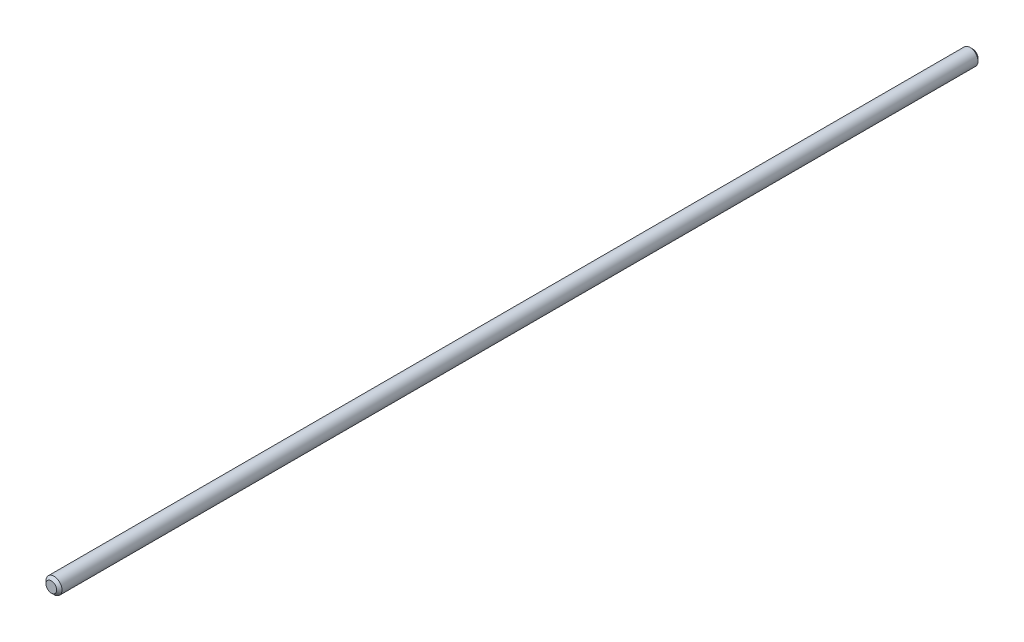
ISO-10303-21;
HEADER;
FILE_DESCRIPTION(('STEP AP214'),'2;1');
FILE_NAME('part.step','',(''),(''),'','','');
FILE_SCHEMA(('AUTOMOTIVE_DESIGN { 1 0 10303 214 1 1 1 1 }'));
ENDSEC;
DATA;
#1=APPLICATION_CONTEXT('core data for automotive mechanical design processes');
#2=APPLICATION_PROTOCOL_DEFINITION('international standard','automotive_design',2000,#1);
#3=PRODUCT_CONTEXT('',#1,'mechanical');
#4=PRODUCT('Part','Part','',(#3));
#5=PRODUCT_RELATED_PRODUCT_CATEGORY('part','',(#4));
#6=PRODUCT_DEFINITION_FORMATION('','',#4);
#7=PRODUCT_DEFINITION_CONTEXT('part definition',#1,'design');
#8=PRODUCT_DEFINITION('design','',#6,#7);
#9=PRODUCT_DEFINITION_SHAPE('','',#8);
#10=(LENGTH_UNIT() NAMED_UNIT(*) SI_UNIT(.MILLI.,.METRE.));
#11=(NAMED_UNIT(*) PLANE_ANGLE_UNIT() SI_UNIT($,.RADIAN.));
#12=(NAMED_UNIT(*) SI_UNIT($,.STERADIAN.) SOLID_ANGLE_UNIT());
#13=UNCERTAINTY_MEASURE_WITH_UNIT(LENGTH_MEASURE(1.E-05),#10,'distance_accuracy_value','');
#14=(GEOMETRIC_REPRESENTATION_CONTEXT(3) GLOBAL_UNCERTAINTY_ASSIGNED_CONTEXT((#13)) GLOBAL_UNIT_ASSIGNED_CONTEXT((#10,
#11,#12)) REPRESENTATION_CONTEXT('',''));
#15=CARTESIAN_POINT('',(0.,0.,0.));
#16=DIRECTION('',(0.,0.,1.));
#17=DIRECTION('',(1.,0.,0.));
#18=AXIS2_PLACEMENT_3D('',#15,#16,#17);
#19=CARTESIAN_POINT('',(0.,0.,172.8));
#20=DIRECTION('',(0.,0.,-1.));
#21=DIRECTION('',(-1.,0.,0.));
#22=AXIS2_PLACEMENT_3D('',#19,#20,#21);
#23=CYLINDRICAL_SURFACE('',#22,1.5);
#24=CARTESIAN_POINT('',(0.,0.,172.3));
#25=DIRECTION('',(0.,0.,1.));
#26=DIRECTION('',(1.,0.,0.));
#27=AXIS2_PLACEMENT_3D('',#24,#25,#26);
#28=CIRCLE('',#27,1.5);
#29=CARTESIAN_POINT('',(-1.5,0.,172.3));
#30=VERTEX_POINT('',#29);
#31=EDGE_CURVE('E44',#30,#30,#28,.F.);
#32=CARTESIAN_POINT('',(0.,0.,0.500000000000139));
#33=DIRECTION('',(0.,0.,1.));
#34=DIRECTION('',(1.,0.,0.));
#35=AXIS2_PLACEMENT_3D('',#32,#33,#34);
#36=CIRCLE('',#35,1.5);
#37=CARTESIAN_POINT('',(-1.5,0.,0.500000000000139));
#38=VERTEX_POINT('',#37);
#39=EDGE_CURVE('E48',#38,#38,#36,.T.);
#40=CARTESIAN_POINT('',(-1.5,0.,172.3));
#41=CARTESIAN_POINT('',(-1.5,0.,170.510416666667));
#42=CARTESIAN_POINT('',(-1.5,0.,168.720833333333));
#43=CARTESIAN_POINT('',(-1.5,0.,165.141666666667));
#44=CARTESIAN_POINT('',(-1.5,0.,163.352083333333));
#45=CARTESIAN_POINT('',(-1.5,0.,159.772916666667));
#46=CARTESIAN_POINT('',(-1.5,0.,157.983333333333));
#47=CARTESIAN_POINT('',(-1.5,0.,154.404166666667));
#48=CARTESIAN_POINT('',(-1.5,0.,152.614583333333));
#49=CARTESIAN_POINT('',(-1.5,0.,149.035416666667));
#50=CARTESIAN_POINT('',(-1.5,0.,147.245833333333));
#51=CARTESIAN_POINT('',(-1.5,0.,143.666666666667));
#52=CARTESIAN_POINT('',(-1.5,0.,141.877083333333));
#53=CARTESIAN_POINT('',(-1.5,0.,138.297916666667));
#54=CARTESIAN_POINT('',(-1.5,0.,136.508333333333));
#55=CARTESIAN_POINT('',(-1.5,0.,132.929166666667));
#56=CARTESIAN_POINT('',(-1.5,0.,131.139583333333));
#57=CARTESIAN_POINT('',(-1.5,0.,127.560416666667));
#58=CARTESIAN_POINT('',(-1.5,0.,125.770833333333));
#59=CARTESIAN_POINT('',(-1.5,0.,122.191666666667));
#60=CARTESIAN_POINT('',(-1.5,0.,120.402083333333));
#61=CARTESIAN_POINT('',(-1.5,0.,116.822916666667));
#62=CARTESIAN_POINT('',(-1.5,0.,115.033333333333));
#63=CARTESIAN_POINT('',(-1.5,0.,111.454166666667));
#64=CARTESIAN_POINT('',(-1.5,0.,109.664583333333));
#65=CARTESIAN_POINT('',(-1.5,0.,106.085416666667));
#66=CARTESIAN_POINT('',(-1.5,0.,104.295833333333));
#67=CARTESIAN_POINT('',(-1.5,0.,100.716666666667));
#68=CARTESIAN_POINT('',(-1.5,0.,98.9270833333334));
#69=CARTESIAN_POINT('',(-1.5,0.,95.3479166666668));
#70=CARTESIAN_POINT('',(-1.5,0.,93.5583333333334));
#71=CARTESIAN_POINT('',(-1.5,0.,89.9791666666668));
#72=CARTESIAN_POINT('',(-1.5,0.,88.1895833333334));
#73=CARTESIAN_POINT('',(-1.5,0.,84.6104166666668));
#74=CARTESIAN_POINT('',(-1.5,0.,82.8208333333334));
#75=CARTESIAN_POINT('',(-1.5,0.,79.2416666666668));
#76=CARTESIAN_POINT('',(-1.5,0.,77.4520833333334));
#77=CARTESIAN_POINT('',(-1.5,0.,73.8729166666668));
#78=CARTESIAN_POINT('',(-1.5,0.,72.0833333333334));
#79=CARTESIAN_POINT('',(-1.5,0.,68.5041666666668));
#80=CARTESIAN_POINT('',(-1.5,0.,66.7145833333334));
#81=CARTESIAN_POINT('',(-1.5,0.,63.1354166666668));
#82=CARTESIAN_POINT('',(-1.5,0.,61.3458333333334));
#83=CARTESIAN_POINT('',(-1.5,0.,57.7666666666668));
#84=CARTESIAN_POINT('',(-1.5,0.,55.9770833333334));
#85=CARTESIAN_POINT('',(-1.5,0.,52.3979166666668));
#86=CARTESIAN_POINT('',(-1.5,0.,50.6083333333334));
#87=CARTESIAN_POINT('',(-1.5,0.,47.0291666666668));
#88=CARTESIAN_POINT('',(-1.5,0.,45.2395833333335));
#89=CARTESIAN_POINT('',(-1.5,0.,41.6604166666668));
#90=CARTESIAN_POINT('',(-1.5,0.,39.8708333333335));
#91=CARTESIAN_POINT('',(-1.5,0.,36.2916666666668));
#92=CARTESIAN_POINT('',(-1.5,0.,34.5020833333335));
#93=CARTESIAN_POINT('',(-1.5,0.,30.9229166666668));
#94=CARTESIAN_POINT('',(-1.5,0.,29.1333333333335));
#95=CARTESIAN_POINT('',(-1.5,0.,25.5541666666668));
#96=CARTESIAN_POINT('',(-1.5,0.,23.7645833333335));
#97=CARTESIAN_POINT('',(-1.5,0.,20.1854166666668));
#98=CARTESIAN_POINT('',(-1.5,0.,18.3958333333335));
#99=CARTESIAN_POINT('',(-1.5,0.,14.8166666666668));
#100=CARTESIAN_POINT('',(-1.5,0.,13.0270833333335));
#101=CARTESIAN_POINT('',(-1.5,0.,9.4479166666668));
#102=CARTESIAN_POINT('',(-1.5,0.,7.65833333333347));
#103=CARTESIAN_POINT('',(-1.5,0.,4.07916666666681));
#104=CARTESIAN_POINT('',(-1.5,0.,2.28958333333347));
#105=CARTESIAN_POINT('',(-1.5,0.,0.500000000000139));
#106=B_SPLINE_CURVE_WITH_KNOTS('',3,(#40,#41,#42,#43,#44,#45,#46,#47,#48,#49,#50,#51,#52,#53,
#54,#55,#56,#57,#58,#59,#60,#61,#62,#63,#64,#65,#66,#67,#68,#69,#70,#71,#72,#73,#74,#75,#76,#77,
#78,#79,#80,#81,#82,#83,#84,#85,#86,#87,#88,#89,#90,#91,#92,#93,#94,#95,#96,#97,#98,#99,#100,
#101,#102,#103,#104,#105),.UNSPECIFIED.,.F.,.F.,(4,2,2,2,2,2,2,2,2,2,2,2,2,2,2,2,2,2,2,2,2,2,2,
2,2,2,2,2,2,2,2,2,4),(0.,5.36874999999998,10.7375,16.10625,21.475,26.84375,32.2124999999999,
37.58125,42.95,48.31875,53.6875,59.0562499999999,64.4249999999999,69.7937499999999,
75.1624999999999,80.5312499999999,85.8999999999999,91.2687499999999,96.6374999999999,102.00625,
107.375,112.74375,118.1125,123.48125,128.85,134.21875,139.5875,144.95625,150.325,155.69375,
161.0625,166.43125,171.8),.UNSPECIFIED.);
#107=EDGE_CURVE('BSEAM36',#30,#38,#106,.T.);
#108=ORIENTED_EDGE('',*,*,#31,.T.);
#109=ORIENTED_EDGE('',*,*,#39,.T.);
#110=ORIENTED_EDGE('',*,*,#107,.T.);
#111=ORIENTED_EDGE('',*,*,#107,.F.);
#112=EDGE_LOOP('',(#108,#110,#109,#111));
#113=FACE_BOUND('',#112,.T.);
#114=ADVANCED_FACE('F36',(#113),#23,.T.);
#115=CARTESIAN_POINT('',(0.,0.,172.8));
#116=DIRECTION('',(0.,0.,1.));
#117=DIRECTION('',(1.,0.,0.));
#118=AXIS2_PLACEMENT_3D('',#115,#116,#117);
#119=PLANE('',#118);
#120=CARTESIAN_POINT('',(0.,0.,172.8));
#121=DIRECTION('',(0.,0.,1.));
#122=DIRECTION('',(1.,0.,0.));
#123=AXIS2_PLACEMENT_3D('',#120,#121,#122);
#124=CIRCLE('',#123,1.00000000000007);
#125=CARTESIAN_POINT('',(1.00000000000007,0.,172.8));
#126=VERTEX_POINT('',#125);
#127=EDGE_CURVE('E52',#126,#126,#124,.T.);
#128=ORIENTED_EDGE('',*,*,#127,.T.);
#129=EDGE_LOOP('',(#128));
#130=FACE_BOUND('',#129,.T.);
#131=ADVANCED_FACE('F58',(#130),#119,.T.);
#132=CARTESIAN_POINT('',(0.,0.,0.));
#133=DIRECTION('',(0.,0.,1.));
#134=DIRECTION('',(1.,0.,0.));
#135=AXIS2_PLACEMENT_3D('',#132,#133,#134);
#136=PLANE('',#135);
#137=CARTESIAN_POINT('',(0.,0.,0.));
#138=DIRECTION('',(0.,0.,1.));
#139=DIRECTION('',(1.,0.,0.));
#140=AXIS2_PLACEMENT_3D('',#137,#138,#139);
#141=CIRCLE('',#140,0.999999999999862);
#142=CARTESIAN_POINT('',(0.999999999999862,0.,0.));
#143=VERTEX_POINT('',#142);
#144=EDGE_CURVE('E10',#143,#143,#141,.F.);
#145=ORIENTED_EDGE('',*,*,#144,.T.);
#146=EDGE_LOOP('',(#145));
#147=FACE_BOUND('',#146,.T.);
#148=ADVANCED_FACE('F62',(#147),#136,.F.);
#149=CARTESIAN_POINT('',(0.,0.,172.8));
#150=DIRECTION('',(0.,0.,-1.));
#151=DIRECTION('',(-1.,0.,0.));
#152=AXIS2_PLACEMENT_3D('',#149,#150,#151);
#153=CONICAL_SURFACE('',#152,1.00000000000007,0.785398163397434);
#154=ORIENTED_EDGE('',*,*,#31,.F.);
#155=EDGE_LOOP('',(#154));
#156=FACE_BOUND('',#155,.T.);
#157=ORIENTED_EDGE('',*,*,#127,.F.);
#158=EDGE_LOOP('',(#157));
#159=FACE_BOUND('',#158,.T.);
#160=ADVANCED_FACE('F60',(#156,#159),#153,.T.);
#161=CARTESIAN_POINT('',(0.,0.,0.500000000000139));
#162=DIRECTION('',(0.,0.,1.));
#163=DIRECTION('',(1.,0.,0.));
#164=AXIS2_PLACEMENT_3D('',#161,#162,#163);
#165=CONICAL_SURFACE('',#164,1.5,0.785398163397447);
#166=ORIENTED_EDGE('',*,*,#144,.F.);
#167=EDGE_LOOP('',(#166));
#168=FACE_BOUND('',#167,.T.);
#169=ORIENTED_EDGE('',*,*,#39,.F.);
#170=EDGE_LOOP('',(#169));
#171=FACE_BOUND('',#170,.T.);
#172=ADVANCED_FACE('F39',(#168,#171),#165,.T.);
#173=CLOSED_SHELL('',(#114,#131,#148,#160,#172));
#174=MANIFOLD_SOLID_BREP('B2',#173);
#175=ADVANCED_BREP_SHAPE_REPRESENTATION('',(#18,#174),#14);
#176=SHAPE_DEFINITION_REPRESENTATION(#9,#175);
ENDSEC;
END-ISO-10303-21;
